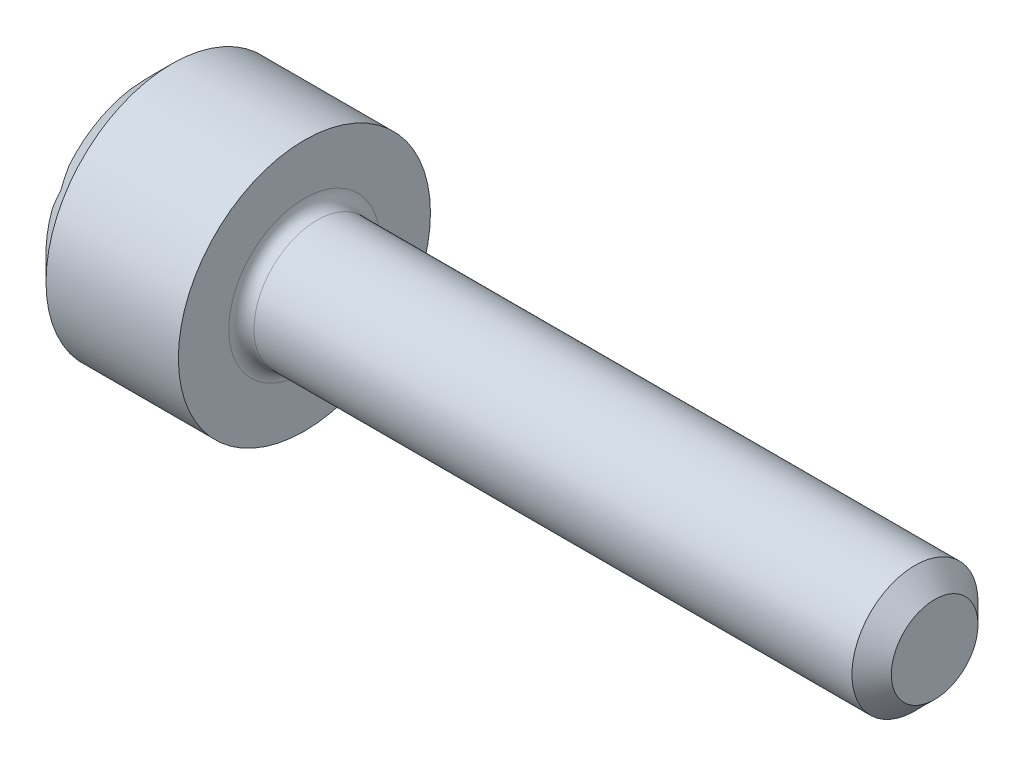
ISO-10303-21;
HEADER;
FILE_DESCRIPTION(('STEP AP214'),'2;1');
FILE_NAME('part.step','',(''),(''),'','','');
FILE_SCHEMA(('AUTOMOTIVE_DESIGN { 1 0 10303 214 1 1 1 1 }'));
ENDSEC;
DATA;
#1=APPLICATION_CONTEXT('core data for automotive mechanical design processes');
#2=APPLICATION_PROTOCOL_DEFINITION('international standard','automotive_design',2000,#1);
#3=PRODUCT_CONTEXT('',#1,'mechanical');
#4=PRODUCT('Part','Part','',(#3));
#5=PRODUCT_RELATED_PRODUCT_CATEGORY('part','',(#4));
#6=PRODUCT_DEFINITION_FORMATION('','',#4);
#7=PRODUCT_DEFINITION_CONTEXT('part definition',#1,'design');
#8=PRODUCT_DEFINITION('design','',#6,#7);
#9=PRODUCT_DEFINITION_SHAPE('','',#8);
#10=(LENGTH_UNIT() NAMED_UNIT(*) SI_UNIT(.MILLI.,.METRE.));
#11=(NAMED_UNIT(*) PLANE_ANGLE_UNIT() SI_UNIT($,.RADIAN.));
#12=(NAMED_UNIT(*) SI_UNIT($,.STERADIAN.) SOLID_ANGLE_UNIT());
#13=UNCERTAINTY_MEASURE_WITH_UNIT(LENGTH_MEASURE(1.E-05),#10,'distance_accuracy_value','');
#14=(GEOMETRIC_REPRESENTATION_CONTEXT(3) GLOBAL_UNCERTAINTY_ASSIGNED_CONTEXT((#13)) GLOBAL_UNIT_ASSIGNED_CONTEXT((#10,
#11,#12)) REPRESENTATION_CONTEXT('',''));
#15=CARTESIAN_POINT('',(0.,0.,0.));
#16=DIRECTION('',(0.,0.,1.));
#17=DIRECTION('',(1.,0.,0.));
#18=AXIS2_PLACEMENT_3D('',#15,#16,#17);
#19=CARTESIAN_POINT('',(0.,0.,0.));
#20=DIRECTION('',(-1.,0.,0.));
#21=DIRECTION('',(0.,0.,1.));
#22=AXIS2_PLACEMENT_3D('',#19,#20,#21);
#23=PLANE('',#22);
#24=DIRECTION('',(0.,0.5,-0.866025403784439));
#25=VECTOR('',#24,1.);
#26=CARTESIAN_POINT('',(0.,1.73205080756888,3.));
#27=LINE('',#26,#25);
#28=CARTESIAN_POINT('',(0.,2.04129977507032,2.46436507609928));
#29=VERTEX_POINT('',#28);
#30=CARTESIAN_POINT('',(0.,3.15485264763631,0.535634923900716));
#31=VERTEX_POINT('',#30);
#32=EDGE_CURVE('E191',#29,#31,#27,.T.);
#33=ORIENTED_EDGE('',*,*,#32,.F.);
#34=CARTESIAN_POINT('',(0.,0.,0.));
#35=DIRECTION('',(-1.,0.,0.));
#36=DIRECTION('',(0.,0.,1.));
#37=AXIS2_PLACEMENT_3D('',#34,#35,#36);
#38=CIRCLE('',#37,3.19999999999999);
#39=EDGE_CURVE('E238',#29,#31,#38,.T.);
#40=ORIENTED_EDGE('',*,*,#39,.T.);
#41=EDGE_LOOP('',(#33,#40));
#42=FACE_BOUND('',#41,.T.);
#43=ADVANCED_FACE('F33',(#42),#23,.T.);
#44=DIRECTION('',(0.,-0.5,-0.866025403784439));
#45=VECTOR('',#44,1.);
#46=CARTESIAN_POINT('',(0.,3.46410161513775,0.));
#47=LINE('',#46,#45);
#48=CARTESIAN_POINT('',(0.,3.15485264763631,-0.535634923900718));
#49=VERTEX_POINT('',#48);
#50=CARTESIAN_POINT('',(0.,2.04129977507032,-2.46436507609928));
#51=VERTEX_POINT('',#50);
#52=EDGE_CURVE('E194',#49,#51,#47,.T.);
#53=ORIENTED_EDGE('',*,*,#52,.F.);
#54=CARTESIAN_POINT('',(0.,0.,0.));
#55=DIRECTION('',(-1.,0.,0.));
#56=DIRECTION('',(0.,0.,1.));
#57=AXIS2_PLACEMENT_3D('',#54,#55,#56);
#58=CIRCLE('',#57,3.19999999999999);
#59=EDGE_CURVE('E236',#49,#51,#58,.T.);
#60=ORIENTED_EDGE('',*,*,#59,.T.);
#61=EDGE_LOOP('',(#53,#60));
#62=FACE_BOUND('',#61,.T.);
#63=ADVANCED_FACE('F303',(#62),#23,.T.);
#64=DIRECTION('',(0.,-1.,0.));
#65=VECTOR('',#64,1.);
#66=CARTESIAN_POINT('',(0.,1.73205080756888,-3.));
#67=LINE('',#66,#65);
#68=CARTESIAN_POINT('',(0.,1.11355287256599,-3.));
#69=VERTEX_POINT('',#68);
#70=CARTESIAN_POINT('',(0.,-1.11355287256599,-3.));
#71=VERTEX_POINT('',#70);
#72=EDGE_CURVE('E156',#69,#71,#67,.T.);
#73=ORIENTED_EDGE('',*,*,#72,.F.);
#74=CARTESIAN_POINT('',(0.,0.,0.));
#75=DIRECTION('',(-1.,0.,0.));
#76=DIRECTION('',(0.,0.,1.));
#77=AXIS2_PLACEMENT_3D('',#74,#75,#76);
#78=CIRCLE('',#77,3.19999999999999);
#79=EDGE_CURVE('E234',#69,#71,#78,.T.);
#80=ORIENTED_EDGE('',*,*,#79,.T.);
#81=EDGE_LOOP('',(#73,#80));
#82=FACE_BOUND('',#81,.T.);
#83=ADVANCED_FACE('F310',(#82),#23,.T.);
#84=DIRECTION('',(0.,-0.5,0.866025403784439));
#85=VECTOR('',#84,1.);
#86=CARTESIAN_POINT('',(0.,-1.73205080756888,-3.));
#87=LINE('',#86,#85);
#88=CARTESIAN_POINT('',(0.,-2.04129977507032,-2.46436507609928));
#89=VERTEX_POINT('',#88);
#90=CARTESIAN_POINT('',(0.,-3.15485264763631,-0.535634923900718));
#91=VERTEX_POINT('',#90);
#92=EDGE_CURVE('E184',#89,#91,#87,.T.);
#93=ORIENTED_EDGE('',*,*,#92,.F.);
#94=CARTESIAN_POINT('',(0.,0.,0.));
#95=DIRECTION('',(-1.,0.,0.));
#96=DIRECTION('',(0.,0.,1.));
#97=AXIS2_PLACEMENT_3D('',#94,#95,#96);
#98=CIRCLE('',#97,3.19999999999999);
#99=EDGE_CURVE('E232',#89,#91,#98,.T.);
#100=ORIENTED_EDGE('',*,*,#99,.T.);
#101=EDGE_LOOP('',(#93,#100));
#102=FACE_BOUND('',#101,.T.);
#103=ADVANCED_FACE('F324',(#102),#23,.T.);
#104=DIRECTION('',(0.,0.5,0.866025403784439));
#105=VECTOR('',#104,1.);
#106=CARTESIAN_POINT('',(0.,-3.46410161513775,0.));
#107=LINE('',#106,#105);
#108=CARTESIAN_POINT('',(0.,-3.15485264763631,0.53563492390072));
#109=VERTEX_POINT('',#108);
#110=CARTESIAN_POINT('',(0.,-2.04129977507032,2.46436507609928));
#111=VERTEX_POINT('',#110);
#112=EDGE_CURVE('E186',#109,#111,#107,.T.);
#113=ORIENTED_EDGE('',*,*,#112,.F.);
#114=CARTESIAN_POINT('',(0.,0.,0.));
#115=DIRECTION('',(-1.,0.,0.));
#116=DIRECTION('',(0.,0.,1.));
#117=AXIS2_PLACEMENT_3D('',#114,#115,#116);
#118=CIRCLE('',#117,3.19999999999999);
#119=EDGE_CURVE('E230',#109,#111,#118,.T.);
#120=ORIENTED_EDGE('',*,*,#119,.T.);
#121=EDGE_LOOP('',(#113,#120));
#122=FACE_BOUND('',#121,.T.);
#123=ADVANCED_FACE('F316',(#122),#23,.T.);
#124=DIRECTION('',(0.,1.,0.));
#125=VECTOR('',#124,1.);
#126=CARTESIAN_POINT('',(0.,-1.73205080756888,3.));
#127=LINE('',#126,#125);
#128=CARTESIAN_POINT('',(0.,-1.11355287256599,3.));
#129=VERTEX_POINT('',#128);
#130=CARTESIAN_POINT('',(0.,1.11355287256599,3.));
#131=VERTEX_POINT('',#130);
#132=EDGE_CURVE('E188',#129,#131,#127,.T.);
#133=ORIENTED_EDGE('',*,*,#132,.F.);
#134=CARTESIAN_POINT('',(0.,0.,0.));
#135=DIRECTION('',(-1.,0.,0.));
#136=DIRECTION('',(0.,0.,1.));
#137=AXIS2_PLACEMENT_3D('',#134,#135,#136);
#138=CIRCLE('',#137,3.19999999999999);
#139=EDGE_CURVE('E228',#129,#131,#138,.T.);
#140=ORIENTED_EDGE('',*,*,#139,.T.);
#141=EDGE_LOOP('',(#133,#140));
#142=FACE_BOUND('',#141,.T.);
#143=ADVANCED_FACE('F306',(#142),#23,.T.);
#144=CARTESIAN_POINT('',(25.,0.,0.));
#145=DIRECTION('',(1.,0.,0.));
#146=DIRECTION('',(0.,0.,-1.));
#147=AXIS2_PLACEMENT_3D('',#144,#145,#146);
#148=CYLINDRICAL_SURFACE('',#147,4.);
#149=CARTESIAN_POINT('',(0.800000000000002,0.,0.));
#150=DIRECTION('',(-1.,0.,0.));
#151=DIRECTION('',(0.,0.,1.));
#152=AXIS2_PLACEMENT_3D('',#149,#150,#151);
#153=CIRCLE('',#152,4.);
#154=CARTESIAN_POINT('',(0.800000000000002,0.,4.));
#155=VERTEX_POINT('',#154);
#156=EDGE_CURVE('E225',#155,#155,#153,.F.);
#157=ORIENTED_EDGE('',*,*,#156,.T.);
#158=EDGE_LOOP('',(#157));
#159=FACE_BOUND('',#158,.T.);
#160=CARTESIAN_POINT('',(5.,0.,0.));
#161=DIRECTION('',(1.,0.,0.));
#162=DIRECTION('',(0.,0.,-1.));
#163=AXIS2_PLACEMENT_3D('',#160,#161,#162);
#164=CIRCLE('',#163,4.);
#165=CARTESIAN_POINT('',(5.,0.,-4.));
#166=VERTEX_POINT('',#165);
#167=EDGE_CURVE('E215',#166,#166,#164,.T.);
#168=ORIENTED_EDGE('',*,*,#167,.F.);
#169=EDGE_LOOP('',(#168));
#170=FACE_BOUND('',#169,.T.);
#171=ADVANCED_FACE('F315',(#159,#170),#148,.T.);
#172=CARTESIAN_POINT('',(5.,0.,-4.));
#173=DIRECTION('',(1.,0.,0.));
#174=DIRECTION('',(0.,0.,-1.));
#175=AXIS2_PLACEMENT_3D('',#172,#173,#174);
#176=PLANE('',#175);
#177=CARTESIAN_POINT('',(5.,0.,0.));
#178=DIRECTION('',(1.,0.,0.));
#179=DIRECTION('',(0.,0.,-1.));
#180=AXIS2_PLACEMENT_3D('',#177,#178,#179);
#181=CIRCLE('',#180,2.4);
#182=CARTESIAN_POINT('',(5.,0.,-2.4));
#183=VERTEX_POINT('',#182);
#184=EDGE_CURVE('E11',#183,#183,#181,.F.);
#185=ORIENTED_EDGE('',*,*,#184,.T.);
#186=EDGE_LOOP('',(#185));
#187=FACE_BOUND('',#186,.T.);
#188=ORIENTED_EDGE('',*,*,#167,.T.);
#189=EDGE_LOOP('',(#188));
#190=FACE_BOUND('',#189,.T.);
#191=ADVANCED_FACE('F322',(#187,#190),#176,.T.);
#192=CARTESIAN_POINT('',(25.,0.,0.));
#193=DIRECTION('',(1.,0.,0.));
#194=DIRECTION('',(0.,0.,-1.));
#195=AXIS2_PLACEMENT_3D('',#192,#193,#194);
#196=CYLINDRICAL_SURFACE('',#195,2.);
#197=CARTESIAN_POINT('',(5.4,0.,0.));
#198=DIRECTION('',(1.,0.,0.));
#199=DIRECTION('',(0.,0.,-1.));
#200=AXIS2_PLACEMENT_3D('',#197,#198,#199);
#201=CIRCLE('',#200,2.);
#202=CARTESIAN_POINT('',(5.4,0.,-2.));
#203=VERTEX_POINT('',#202);
#204=EDGE_CURVE('E41',#203,#203,#201,.T.);
#205=ORIENTED_EDGE('',*,*,#204,.T.);
#206=EDGE_LOOP('',(#205));
#207=FACE_BOUND('',#206,.T.);
#208=CARTESIAN_POINT('',(24.375,0.,0.));
#209=DIRECTION('',(1.,0.,0.));
#210=DIRECTION('',(0.,0.,-1.));
#211=AXIS2_PLACEMENT_3D('',#208,#209,#210);
#212=CIRCLE('',#211,2.);
#213=CARTESIAN_POINT('',(24.375,0.,-2.));
#214=VERTEX_POINT('',#213);
#215=EDGE_CURVE('E222',#214,#214,#212,.F.);
#216=ORIENTED_EDGE('',*,*,#215,.T.);
#217=EDGE_LOOP('',(#216));
#218=FACE_BOUND('',#217,.T.);
#219=ADVANCED_FACE('F291',(#207,#218),#196,.T.);
#220=CARTESIAN_POINT('',(25.,0.,-2.));
#221=DIRECTION('',(1.,0.,0.));
#222=DIRECTION('',(0.,0.,-1.));
#223=AXIS2_PLACEMENT_3D('',#220,#221,#222);
#224=PLANE('',#223);
#225=CARTESIAN_POINT('',(25.,0.,0.));
#226=DIRECTION('',(1.,0.,0.));
#227=DIRECTION('',(0.,0.,-1.));
#228=AXIS2_PLACEMENT_3D('',#225,#226,#227);
#229=CIRCLE('',#228,1.375);
#230=CARTESIAN_POINT('',(25.,0.,-1.375));
#231=VERTEX_POINT('',#230);
#232=EDGE_CURVE('E219',#231,#231,#229,.T.);
#233=ORIENTED_EDGE('',*,*,#232,.T.);
#234=EDGE_LOOP('',(#233));
#235=FACE_BOUND('',#234,.T.);
#236=ADVANCED_FACE('F367',(#235),#224,.T.);
#237=CARTESIAN_POINT('',(25.,0.,0.));
#238=DIRECTION('',(-1.,0.,0.));
#239=DIRECTION('',(0.,0.,1.));
#240=AXIS2_PLACEMENT_3D('',#237,#238,#239);
#241=CONICAL_SURFACE('',#240,1.375,0.785398163397445);
#242=ORIENTED_EDGE('',*,*,#215,.F.);
#243=EDGE_LOOP('',(#242));
#244=FACE_BOUND('',#243,.T.);
#245=ORIENTED_EDGE('',*,*,#232,.F.);
#246=EDGE_LOOP('',(#245));
#247=FACE_BOUND('',#246,.T.);
#248=ADVANCED_FACE('F361',(#244,#247),#241,.T.);
#249=CARTESIAN_POINT('',(4.,-1.73205080756888,-3.));
#250=DIRECTION('',(0.,-0.866025403784439,-0.5));
#251=DIRECTION('',(0.,0.5,-0.866025403784439));
#252=AXIS2_PLACEMENT_3D('',#249,#250,#251);
#253=PLANE('',#252);
#254=DIRECTION('',(-1.,0.,0.));
#255=VECTOR('',#254,1.);
#256=CARTESIAN_POINT('',(4.,-1.73205080756888,-3.));
#257=LINE('',#256,#255);
#258=CARTESIAN_POINT('',(4.,-1.73205080756888,-3.));
#259=VERTEX_POINT('',#258);
#260=CARTESIAN_POINT('',(0.264101615137759,-1.73205080756888,-3.));
#261=VERTEX_POINT('',#260);
#262=EDGE_CURVE('E199',#259,#261,#257,.T.);
#263=ORIENTED_EDGE('',*,*,#262,.T.);
#264=CARTESIAN_POINT('',(0.264101615137759,-1.73205080756888,-3.));
#265=CARTESIAN_POINT('',(0.239013045834171,-1.75714195340964,-2.95654086058369));
#266=CARTESIAN_POINT('',(0.21457247390792,-1.78239782369679,-2.91279641005696));
#267=CARTESIAN_POINT('',(0.167188466711546,-1.83322609179336,-2.82475926725298));
#268=CARTESIAN_POINT('',(0.144243512742113,-1.85879813612875,-2.78046718721067));
#269=CARTESIAN_POINT('',(0.0999964216523164,-1.91030100221665,-2.69126160641101));
#270=CARTESIAN_POINT('',(0.0786945049648063,-1.93623187156128,-2.64634802322169));
#271=CARTESIAN_POINT('',(0.0379179650521344,-1.988480607889,-2.5558505572708));
#272=CARTESIAN_POINT('',(0.0184452524003179,-2.01479884701433,-2.51026602993998));
#273=CARTESIAN_POINT('',(0.,-2.04129977507032,-2.46436507609928));
#274=B_SPLINE_CURVE_WITH_KNOTS('',3,(#264,#265,#266,#267,#268,#269,#270,#271,#272,#273),
.UNSPECIFIED.,.F.,.F.,(4,2,2,2,4),(0.,0.168315435098067,0.336457205423019,0.504621494855378,
0.672959520299338),.UNSPECIFIED.);
#275=EDGE_CURVE('E336',#261,#89,#274,.T.);
#276=ORIENTED_EDGE('',*,*,#275,.T.);
#277=ORIENTED_EDGE('',*,*,#92,.T.);
#278=CARTESIAN_POINT('',(0.,-3.15485264763631,-0.535634923900718));
#279=CARTESIAN_POINT('',(0.018445252400318,-3.1813535756923,-0.489733970060021));
#280=CARTESIAN_POINT('',(0.0379179650521344,-3.20767181481763,-0.444149442729196));
#281=CARTESIAN_POINT('',(0.0786945049648063,-3.25992055114536,-0.353651976778307));
#282=CARTESIAN_POINT('',(0.0999964216523164,-3.28585142048998,-0.308738393588991));
#283=CARTESIAN_POINT('',(0.144243512742113,-3.33735428657788,-0.219532812789328));
#284=CARTESIAN_POINT('',(0.167188466711547,-3.36292633091328,-0.175240732747018));
#285=CARTESIAN_POINT('',(0.21457247390792,-3.41375459900984,-0.0872035899430409));
#286=CARTESIAN_POINT('',(0.239013045834171,-3.439010469297,-0.0434591394163142));
#287=CARTESIAN_POINT('',(0.264101615137759,-3.46410161513775,0.));
#288=B_SPLINE_CURVE_WITH_KNOTS('',3,(#278,#279,#280,#281,#282,#283,#284,#285,#286,#287),
.UNSPECIFIED.,.F.,.F.,(4,2,2,2,4),(0.,0.16833802544396,0.336502314876319,0.504644085201271,
0.672959520299337),.UNSPECIFIED.);
#289=CARTESIAN_POINT('',(0.264101615137759,-3.46410161513775,0.));
#290=VERTEX_POINT('',#289);
#291=EDGE_CURVE('E56',#91,#290,#288,.T.);
#292=ORIENTED_EDGE('',*,*,#291,.T.);
#293=DIRECTION('',(-1.,0.,0.));
#294=VECTOR('',#293,1.);
#295=CARTESIAN_POINT('',(4.,-3.46410161513775,0.));
#296=LINE('',#295,#294);
#297=CARTESIAN_POINT('',(4.,-3.46410161513775,0.));
#298=VERTEX_POINT('',#297);
#299=EDGE_CURVE('E158',#298,#290,#296,.T.);
#300=ORIENTED_EDGE('',*,*,#299,.F.);
#301=DIRECTION('',(0.,-0.5,0.866025403784439));
#302=VECTOR('',#301,1.);
#303=CARTESIAN_POINT('',(4.,-1.73205080756888,-3.));
#304=LINE('',#303,#302);
#305=CARTESIAN_POINT('',(4.,-2.59807621135332,-1.5));
#306=VERTEX_POINT('',#305);
#307=EDGE_CURVE('E147',#306,#298,#304,.T.);
#308=ORIENTED_EDGE('',*,*,#307,.F.);
#309=EDGE_CURVE('E155',#259,#306,#304,.T.);
#310=ORIENTED_EDGE('',*,*,#309,.F.);
#311=EDGE_LOOP('',(#263,#276,#277,#292,#300,#308,#310));
#312=FACE_BOUND('',#311,.T.);
#313=ADVANCED_FACE('F160',(#312),#253,.F.);
#314=CARTESIAN_POINT('',(4.,1.73205080756888,-3.));
#315=DIRECTION('',(0.,0.,-1.));
#316=DIRECTION('',(-1.,0.,0.));
#317=AXIS2_PLACEMENT_3D('',#314,#315,#316);
#318=PLANE('',#317);
#319=DIRECTION('',(-1.,0.,0.));
#320=VECTOR('',#319,1.);
#321=CARTESIAN_POINT('',(4.,1.73205080756888,-3.));
#322=LINE('',#321,#320);
#323=CARTESIAN_POINT('',(4.,1.73205080756888,-3.));
#324=VERTEX_POINT('',#323);
#325=CARTESIAN_POINT('',(0.264101615137759,1.73205080756888,-3.));
#326=VERTEX_POINT('',#325);
#327=EDGE_CURVE('E202',#324,#326,#322,.T.);
#328=ORIENTED_EDGE('',*,*,#327,.T.);
#329=CARTESIAN_POINT('',(0.264101615137759,1.73205080756888,-3.));
#330=CARTESIAN_POINT('',(0.239013045834171,1.68186851588736,-3.));
#331=CARTESIAN_POINT('',(0.21457247390792,1.63135677531305,-3.));
#332=CARTESIAN_POINT('',(0.167188466711546,1.52970023911992,-3.));
#333=CARTESIAN_POINT('',(0.144243512742114,1.47855615044913,-3.));
#334=CARTESIAN_POINT('',(0.0999964216523165,1.37555041827332,-3.));
#335=CARTESIAN_POINT('',(0.0786945049648063,1.32368867958408,-3.));
#336=CARTESIAN_POINT('',(0.0379179650521342,1.21919120692863,-3.));
#337=CARTESIAN_POINT('',(0.0184452524003177,1.16655472867796,-3.));
#338=CARTESIAN_POINT('',(0.,1.11355287256599,-3.));
#339=B_SPLINE_CURVE_WITH_KNOTS('',3,(#329,#330,#331,#332,#333,#334,#335,#336,#337,#338),
.UNSPECIFIED.,.F.,.F.,(4,2,2,2,4),(0.,0.168315435098067,0.336457205423019,0.504621494855379,
0.672959520299339),.UNSPECIFIED.);
#340=EDGE_CURVE('E560',#326,#69,#339,.T.);
#341=ORIENTED_EDGE('',*,*,#340,.T.);
#342=ORIENTED_EDGE('',*,*,#72,.T.);
#343=CARTESIAN_POINT('',(0.,-1.11355287256599,-3.));
#344=CARTESIAN_POINT('',(0.0184452524003176,-1.16655472867796,-3.));
#345=CARTESIAN_POINT('',(0.0379179650521341,-1.21919120692863,-3.));
#346=CARTESIAN_POINT('',(0.0786945049648061,-1.32368867958408,-3.));
#347=CARTESIAN_POINT('',(0.0999964216523164,-1.37555041827332,-3.));
#348=CARTESIAN_POINT('',(0.144243512742114,-1.47855615044913,-3.));
#349=CARTESIAN_POINT('',(0.167188466711546,-1.52970023911992,-3.));
#350=CARTESIAN_POINT('',(0.21457247390792,-1.63135677531305,-3.));
#351=CARTESIAN_POINT('',(0.239013045834171,-1.68186851588736,-3.));
#352=CARTESIAN_POINT('',(0.264101615137759,-1.73205080756888,-3.));
#353=B_SPLINE_CURVE_WITH_KNOTS('',3,(#343,#344,#345,#346,#347,#348,#349,#350,#351,#352),
.UNSPECIFIED.,.F.,.F.,(4,2,2,2,4),(0.,0.16833802544396,0.336502314876319,0.504644085201271,
0.672959520299339),.UNSPECIFIED.);
#354=EDGE_CURVE('E561',#71,#261,#353,.T.);
#355=ORIENTED_EDGE('',*,*,#354,.T.);
#356=ORIENTED_EDGE('',*,*,#262,.F.);
#357=DIRECTION('',(0.,-1.,0.));
#358=VECTOR('',#357,1.);
#359=CARTESIAN_POINT('',(4.,1.73205080756888,-3.));
#360=LINE('',#359,#358);
#361=CARTESIAN_POINT('',(4.,0.,-3.));
#362=VERTEX_POINT('',#361);
#363=EDGE_CURVE('E181',#362,#259,#360,.T.);
#364=ORIENTED_EDGE('',*,*,#363,.F.);
#365=EDGE_CURVE('E163',#324,#362,#360,.T.);
#366=ORIENTED_EDGE('',*,*,#365,.F.);
#367=EDGE_LOOP('',(#328,#341,#342,#355,#356,#364,#366));
#368=FACE_BOUND('',#367,.T.);
#369=ADVANCED_FACE('F360',(#368),#318,.F.);
#370=CARTESIAN_POINT('',(4.,3.46410161513775,0.));
#371=DIRECTION('',(0.,0.866025403784439,-0.5));
#372=DIRECTION('',(0.,0.5,0.866025403784439));
#373=AXIS2_PLACEMENT_3D('',#370,#371,#372);
#374=PLANE('',#373);
#375=DIRECTION('',(-1.,0.,0.));
#376=VECTOR('',#375,1.);
#377=CARTESIAN_POINT('',(4.,3.46410161513775,0.));
#378=LINE('',#377,#376);
#379=CARTESIAN_POINT('',(4.,3.46410161513775,0.));
#380=VERTEX_POINT('',#379);
#381=CARTESIAN_POINT('',(0.264101615137759,3.46410161513775,0.));
#382=VERTEX_POINT('',#381);
#383=EDGE_CURVE('E205',#380,#382,#378,.T.);
#384=ORIENTED_EDGE('',*,*,#383,.T.);
#385=CARTESIAN_POINT('',(0.264101615137759,3.46410161513775,0.));
#386=CARTESIAN_POINT('',(0.239013045834171,3.439010469297,-0.043459139416314));
#387=CARTESIAN_POINT('',(0.21457247390792,3.41375459900984,-0.0872035899430408));
#388=CARTESIAN_POINT('',(0.167188466711546,3.36292633091328,-0.175240732747017));
#389=CARTESIAN_POINT('',(0.144243512742113,3.33735428657788,-0.219532812789328));
#390=CARTESIAN_POINT('',(0.099996421652316,3.28585142048998,-0.308738393588991));
#391=CARTESIAN_POINT('',(0.078694504964806,3.25992055114536,-0.353651976778307));
#392=CARTESIAN_POINT('',(0.0379179650521343,3.20767181481763,-0.444149442729196));
#393=CARTESIAN_POINT('',(0.0184452524003179,3.1813535756923,-0.489733970060021));
#394=CARTESIAN_POINT('',(0.,3.15485264763631,-0.535634923900718));
#395=B_SPLINE_CURVE_WITH_KNOTS('',3,(#385,#386,#387,#388,#389,#390,#391,#392,#393,#394),
.UNSPECIFIED.,.F.,.F.,(4,2,2,2,4),(0.,0.168315435098067,0.336457205423019,0.504621494855378,
0.672959520299337),.UNSPECIFIED.);
#396=EDGE_CURVE('E564',#382,#49,#395,.T.);
#397=ORIENTED_EDGE('',*,*,#396,.T.);
#398=ORIENTED_EDGE('',*,*,#52,.T.);
#399=CARTESIAN_POINT('',(0.,2.04129977507032,-2.46436507609928));
#400=CARTESIAN_POINT('',(0.0184452524003179,2.01479884701433,-2.51026602993998));
#401=CARTESIAN_POINT('',(0.0379179650521344,1.988480607889,-2.5558505572708));
#402=CARTESIAN_POINT('',(0.0786945049648065,1.93623187156128,-2.64634802322169));
#403=CARTESIAN_POINT('',(0.0999964216523167,1.91030100221665,-2.69126160641101));
#404=CARTESIAN_POINT('',(0.144243512742114,1.85879813612875,-2.78046718721067));
#405=CARTESIAN_POINT('',(0.167188466711547,1.83322609179336,-2.82475926725298));
#406=CARTESIAN_POINT('',(0.21457247390792,1.78239782369679,-2.91279641005696));
#407=CARTESIAN_POINT('',(0.239013045834171,1.75714195340964,-2.95654086058369));
#408=CARTESIAN_POINT('',(0.264101615137759,1.73205080756888,-3.));
#409=B_SPLINE_CURVE_WITH_KNOTS('',3,(#399,#400,#401,#402,#403,#404,#405,#406,#407,#408),
.UNSPECIFIED.,.F.,.F.,(4,2,2,2,4),(0.,0.16833802544396,0.336502314876319,0.504644085201272,
0.672959520299338),.UNSPECIFIED.);
#410=EDGE_CURVE('E581',#51,#326,#409,.T.);
#411=ORIENTED_EDGE('',*,*,#410,.T.);
#412=ORIENTED_EDGE('',*,*,#327,.F.);
#413=DIRECTION('',(0.,-0.5,-0.866025403784439));
#414=VECTOR('',#413,1.);
#415=CARTESIAN_POINT('',(4.,3.46410161513775,0.));
#416=LINE('',#415,#414);
#417=CARTESIAN_POINT('',(4.,2.59807621135332,-1.5));
#418=VERTEX_POINT('',#417);
#419=EDGE_CURVE('E177',#418,#324,#416,.T.);
#420=ORIENTED_EDGE('',*,*,#419,.F.);
#421=EDGE_CURVE('E178',#380,#418,#416,.T.);
#422=ORIENTED_EDGE('',*,*,#421,.F.);
#423=EDGE_LOOP('',(#384,#397,#398,#411,#412,#420,#422));
#424=FACE_BOUND('',#423,.T.);
#425=ADVANCED_FACE('F263',(#424),#374,.F.);
#426=CARTESIAN_POINT('',(4.,1.73205080756888,3.));
#427=DIRECTION('',(0.,0.866025403784439,0.5));
#428=DIRECTION('',(0.,-0.5,0.866025403784439));
#429=AXIS2_PLACEMENT_3D('',#426,#427,#428);
#430=PLANE('',#429);
#431=ORIENTED_EDGE('',*,*,#32,.T.);
#432=CARTESIAN_POINT('',(0.,3.15485264763631,0.535634923900716));
#433=CARTESIAN_POINT('',(0.018445252400318,3.1813535756923,0.489733970060019));
#434=CARTESIAN_POINT('',(0.0379179650521344,3.20767181481763,0.444149442729195));
#435=CARTESIAN_POINT('',(0.0786945049648063,3.25992055114536,0.353651976778306));
#436=CARTESIAN_POINT('',(0.0999964216523164,3.28585142048998,0.30873839358899));
#437=CARTESIAN_POINT('',(0.144243512742113,3.33735428657788,0.219532812789327));
#438=CARTESIAN_POINT('',(0.167188466711546,3.36292633091328,0.175240732747017));
#439=CARTESIAN_POINT('',(0.21457247390792,3.41375459900984,0.0872035899430405));
#440=CARTESIAN_POINT('',(0.239013045834171,3.439010469297,0.0434591394163139));
#441=CARTESIAN_POINT('',(0.264101615137759,3.46410161513775,0.));
#442=B_SPLINE_CURVE_WITH_KNOTS('',3,(#432,#433,#434,#435,#436,#437,#438,#439,#440,#441),
.UNSPECIFIED.,.F.,.F.,(4,2,2,2,4),(0.,0.168338025443959,0.336502314876318,0.504644085201269,
0.672959520299336),.UNSPECIFIED.);
#443=EDGE_CURVE('E248',#31,#382,#442,.T.);
#444=ORIENTED_EDGE('',*,*,#443,.T.);
#445=ORIENTED_EDGE('',*,*,#383,.F.);
#446=DIRECTION('',(0.,0.5,-0.866025403784439));
#447=VECTOR('',#446,1.);
#448=CARTESIAN_POINT('',(4.,1.73205080756888,3.));
#449=LINE('',#448,#447);
#450=CARTESIAN_POINT('',(4.,2.59807621135332,1.5));
#451=VERTEX_POINT('',#450);
#452=EDGE_CURVE('E173',#451,#380,#449,.T.);
#453=ORIENTED_EDGE('',*,*,#452,.F.);
#454=CARTESIAN_POINT('',(4.,1.73205080756888,3.));
#455=VERTEX_POINT('',#454);
#456=EDGE_CURVE('E174',#455,#451,#449,.T.);
#457=ORIENTED_EDGE('',*,*,#456,.F.);
#458=DIRECTION('',(-1.,0.,0.));
#459=VECTOR('',#458,1.);
#460=CARTESIAN_POINT('',(4.,1.73205080756888,3.));
#461=LINE('',#460,#459);
#462=CARTESIAN_POINT('',(0.264101615137759,1.73205080756888,3.));
#463=VERTEX_POINT('',#462);
#464=EDGE_CURVE('E208',#455,#463,#461,.T.);
#465=ORIENTED_EDGE('',*,*,#464,.T.);
#466=CARTESIAN_POINT('',(0.264101615137759,1.73205080756888,3.));
#467=CARTESIAN_POINT('',(0.239013045834171,1.75714195340964,2.95654086058369));
#468=CARTESIAN_POINT('',(0.21457247390792,1.78239782369679,2.91279641005696));
#469=CARTESIAN_POINT('',(0.167188466711546,1.83322609179335,2.82475926725298));
#470=CARTESIAN_POINT('',(0.144243512742113,1.85879813612875,2.78046718721067));
#471=CARTESIAN_POINT('',(0.0999964216523164,1.91030100221665,2.69126160641101));
#472=CARTESIAN_POINT('',(0.0786945049648063,1.93623187156128,2.64634802322169));
#473=CARTESIAN_POINT('',(0.0379179650521345,1.988480607889,2.55585055727081));
#474=CARTESIAN_POINT('',(0.0184452524003182,2.01479884701433,2.51026602993998));
#475=CARTESIAN_POINT('',(0.,2.04129977507032,2.46436507609928));
#476=B_SPLINE_CURVE_WITH_KNOTS('',3,(#466,#467,#468,#469,#470,#471,#472,#473,#474,#475),
.UNSPECIFIED.,.F.,.F.,(4,2,2,2,4),(0.,0.168315435098067,0.336457205423018,0.504621494855377,
0.672959520299336),.UNSPECIFIED.);
#477=EDGE_CURVE('E241',#463,#29,#476,.T.);
#478=ORIENTED_EDGE('',*,*,#477,.T.);
#479=EDGE_LOOP('',(#431,#444,#445,#453,#457,#465,#478));
#480=FACE_BOUND('',#479,.T.);
#481=ADVANCED_FACE('F257',(#480),#430,.F.);
#482=CARTESIAN_POINT('',(4.,-1.73205080756888,3.));
#483=DIRECTION('',(0.,0.,1.));
#484=DIRECTION('',(0.,-1.,0.));
#485=AXIS2_PLACEMENT_3D('',#482,#483,#484);
#486=PLANE('',#485);
#487=DIRECTION('',(-1.,0.,0.));
#488=VECTOR('',#487,1.);
#489=CARTESIAN_POINT('',(4.,-1.73205080756888,3.));
#490=LINE('',#489,#488);
#491=CARTESIAN_POINT('',(4.,-1.73205080756888,3.));
#492=VERTEX_POINT('',#491);
#493=CARTESIAN_POINT('',(0.26410161513776,-1.73205080756888,3.));
#494=VERTEX_POINT('',#493);
#495=EDGE_CURVE('E162',#492,#494,#490,.T.);
#496=ORIENTED_EDGE('',*,*,#495,.T.);
#497=CARTESIAN_POINT('',(0.26410161513776,-1.73205080756888,3.));
#498=CARTESIAN_POINT('',(0.239013045834172,-1.68186851588736,3.));
#499=CARTESIAN_POINT('',(0.214572473907921,-1.63135677531305,3.));
#500=CARTESIAN_POINT('',(0.167188466711547,-1.52970023911992,3.));
#501=CARTESIAN_POINT('',(0.144243512742114,-1.47855615044913,3.));
#502=CARTESIAN_POINT('',(0.099996421652317,-1.37555041827332,3.));
#503=CARTESIAN_POINT('',(0.0786945049648067,-1.32368867958408,3.));
#504=CARTESIAN_POINT('',(0.0379179650521346,-1.21919120692863,3.));
#505=CARTESIAN_POINT('',(0.018445252400318,-1.16655472867796,3.));
#506=CARTESIAN_POINT('',(0.,-1.11355287256599,3.));
#507=B_SPLINE_CURVE_WITH_KNOTS('',3,(#497,#498,#499,#500,#501,#502,#503,#504,#505,#506),
.UNSPECIFIED.,.F.,.F.,(4,2,2,2,4),(0.,0.168315435098067,0.336457205423019,0.504621494855379,
0.67295952029934),.UNSPECIFIED.);
#508=EDGE_CURVE('E283',#494,#129,#507,.T.);
#509=ORIENTED_EDGE('',*,*,#508,.T.);
#510=ORIENTED_EDGE('',*,*,#132,.T.);
#511=CARTESIAN_POINT('',(0.,1.11355287256599,3.));
#512=CARTESIAN_POINT('',(0.0184452524003177,1.16655472867796,3.));
#513=CARTESIAN_POINT('',(0.0379179650521341,1.21919120692863,3.));
#514=CARTESIAN_POINT('',(0.0786945049648061,1.32368867958408,3.));
#515=CARTESIAN_POINT('',(0.0999964216523163,1.37555041827332,3.));
#516=CARTESIAN_POINT('',(0.144243512742113,1.47855615044913,3.));
#517=CARTESIAN_POINT('',(0.167188466711546,1.52970023911992,3.));
#518=CARTESIAN_POINT('',(0.21457247390792,1.63135677531304,3.));
#519=CARTESIAN_POINT('',(0.239013045834171,1.68186851588736,3.));
#520=CARTESIAN_POINT('',(0.264101615137759,1.73205080756888,3.));
#521=B_SPLINE_CURVE_WITH_KNOTS('',3,(#511,#512,#513,#514,#515,#516,#517,#518,#519,#520),
.UNSPECIFIED.,.F.,.F.,(4,2,2,2,4),(0.,0.16833802544396,0.336502314876319,0.504644085201271,
0.672959520299337),.UNSPECIFIED.);
#522=EDGE_CURVE('E276',#131,#463,#521,.T.);
#523=ORIENTED_EDGE('',*,*,#522,.T.);
#524=ORIENTED_EDGE('',*,*,#464,.F.);
#525=DIRECTION('',(0.,1.,0.));
#526=VECTOR('',#525,1.);
#527=CARTESIAN_POINT('',(4.,-1.73205080756888,3.));
#528=LINE('',#527,#526);
#529=CARTESIAN_POINT('',(4.,0.,3.));
#530=VERTEX_POINT('',#529);
#531=EDGE_CURVE('E168',#530,#455,#528,.T.);
#532=ORIENTED_EDGE('',*,*,#531,.F.);
#533=EDGE_CURVE('E170',#492,#530,#528,.T.);
#534=ORIENTED_EDGE('',*,*,#533,.F.);
#535=EDGE_LOOP('',(#496,#509,#510,#523,#524,#532,#534));
#536=FACE_BOUND('',#535,.T.);
#537=ADVANCED_FACE('F262',(#536),#486,.F.);
#538=CARTESIAN_POINT('',(4.,-3.46410161513775,0.));
#539=DIRECTION('',(0.,-0.866025403784439,0.5));
#540=DIRECTION('',(0.,-0.5,-0.866025403784439));
#541=AXIS2_PLACEMENT_3D('',#538,#539,#540);
#542=PLANE('',#541);
#543=ORIENTED_EDGE('',*,*,#299,.T.);
#544=CARTESIAN_POINT('',(0.264101615137759,-3.46410161513775,0.));
#545=CARTESIAN_POINT('',(0.239013045834172,-3.439010469297,0.0434591394163139));
#546=CARTESIAN_POINT('',(0.21457247390792,-3.41375459900984,0.0872035899430408));
#547=CARTESIAN_POINT('',(0.167188466711547,-3.36292633091328,0.175240732747018));
#548=CARTESIAN_POINT('',(0.144243512742114,-3.33735428657788,0.219532812789329));
#549=CARTESIAN_POINT('',(0.0999964216523162,-3.28585142048998,0.308738393588992));
#550=CARTESIAN_POINT('',(0.0786945049648059,-3.25992055114536,0.353651976778308));
#551=CARTESIAN_POINT('',(0.0379179650521338,-3.20767181481763,0.444149442729197));
#552=CARTESIAN_POINT('',(0.0184452524003173,-3.1813535756923,0.489733970060022));
#553=CARTESIAN_POINT('',(0.,-3.15485264763631,0.53563492390072));
#554=B_SPLINE_CURVE_WITH_KNOTS('',3,(#544,#545,#546,#547,#548,#549,#550,#551,#552,#553),
.UNSPECIFIED.,.F.,.F.,(4,2,2,2,4),(0.,0.168315435098067,0.33645720542302,0.50462149485538,
0.67295952029934),.UNSPECIFIED.);
#555=EDGE_CURVE('E334',#290,#109,#554,.T.);
#556=ORIENTED_EDGE('',*,*,#555,.T.);
#557=ORIENTED_EDGE('',*,*,#112,.T.);
#558=CARTESIAN_POINT('',(0.,-2.04129977507032,2.46436507609928));
#559=CARTESIAN_POINT('',(0.0184452524003178,-2.01479884701434,2.51026602993998));
#560=CARTESIAN_POINT('',(0.0379179650521343,-1.988480607889,2.5558505572708));
#561=CARTESIAN_POINT('',(0.0786945049648065,-1.93623187156128,2.64634802322169));
#562=CARTESIAN_POINT('',(0.0999964216523167,-1.91030100221666,2.69126160641101));
#563=CARTESIAN_POINT('',(0.144243512742114,-1.85879813612875,2.78046718721067));
#564=CARTESIAN_POINT('',(0.167188466711547,-1.83322609179336,2.82475926725298));
#565=CARTESIAN_POINT('',(0.214572473907921,-1.78239782369679,2.91279641005696));
#566=CARTESIAN_POINT('',(0.239013045834172,-1.75714195340964,2.95654086058369));
#567=CARTESIAN_POINT('',(0.26410161513776,-1.73205080756888,3.));
#568=B_SPLINE_CURVE_WITH_KNOTS('',3,(#558,#559,#560,#561,#562,#563,#564,#565,#566,#567),
.UNSPECIFIED.,.F.,.F.,(4,2,2,2,4),(0.,0.168338025443961,0.33650231487632,0.504644085201273,
0.672959520299341),.UNSPECIFIED.);
#569=EDGE_CURVE('E48',#111,#494,#568,.T.);
#570=ORIENTED_EDGE('',*,*,#569,.T.);
#571=ORIENTED_EDGE('',*,*,#495,.F.);
#572=DIRECTION('',(0.,0.5,0.866025403784439));
#573=VECTOR('',#572,1.);
#574=CARTESIAN_POINT('',(4.,-3.46410161513775,0.));
#575=LINE('',#574,#573);
#576=CARTESIAN_POINT('',(4.,-2.59807621135332,1.5));
#577=VERTEX_POINT('',#576);
#578=EDGE_CURVE('E167',#577,#492,#575,.T.);
#579=ORIENTED_EDGE('',*,*,#578,.F.);
#580=EDGE_CURVE('E150',#298,#577,#575,.T.);
#581=ORIENTED_EDGE('',*,*,#580,.F.);
#582=EDGE_LOOP('',(#543,#556,#557,#570,#571,#579,#581));
#583=FACE_BOUND('',#582,.T.);
#584=ADVANCED_FACE('F166',(#583),#542,.F.);
#585=CARTESIAN_POINT('',(4.,0.,0.));
#586=DIRECTION('',(-1.,0.,0.));
#587=DIRECTION('',(0.,0.,1.));
#588=AXIS2_PLACEMENT_3D('',#585,#586,#587);
#589=PLANE('',#588);
#590=ORIENTED_EDGE('',*,*,#531,.T.);
#591=ORIENTED_EDGE('',*,*,#456,.T.);
#592=CARTESIAN_POINT('',(4.,0.,0.));
#593=DIRECTION('',(-1.,0.,0.));
#594=DIRECTION('',(0.,0.,1.));
#595=AXIS2_PLACEMENT_3D('',#592,#593,#594);
#596=CIRCLE('',#595,3.);
#597=EDGE_CURVE('E212',#530,#451,#596,.T.);
#598=ORIENTED_EDGE('',*,*,#597,.F.);
#599=EDGE_LOOP('',(#590,#591,#598));
#600=FACE_BOUND('',#599,.T.);
#601=ADVANCED_FACE('F428',(#600),#589,.T.);
#602=ORIENTED_EDGE('',*,*,#452,.T.);
#603=ORIENTED_EDGE('',*,*,#421,.T.);
#604=EDGE_CURVE('E216',#451,#418,#596,.T.);
#605=ORIENTED_EDGE('',*,*,#604,.F.);
#606=EDGE_LOOP('',(#602,#603,#605));
#607=FACE_BOUND('',#606,.T.);
#608=ADVANCED_FACE('F433',(#607),#589,.T.);
#609=ORIENTED_EDGE('',*,*,#419,.T.);
#610=ORIENTED_EDGE('',*,*,#365,.T.);
#611=EDGE_CURVE('E604',#418,#362,#596,.T.);
#612=ORIENTED_EDGE('',*,*,#611,.F.);
#613=EDGE_LOOP('',(#609,#610,#612));
#614=FACE_BOUND('',#613,.T.);
#615=ADVANCED_FACE('F441',(#614),#589,.T.);
#616=ORIENTED_EDGE('',*,*,#363,.T.);
#617=ORIENTED_EDGE('',*,*,#309,.T.);
#618=EDGE_CURVE('E599',#362,#306,#596,.T.);
#619=ORIENTED_EDGE('',*,*,#618,.F.);
#620=EDGE_LOOP('',(#616,#617,#619));
#621=FACE_BOUND('',#620,.T.);
#622=ADVANCED_FACE('F448',(#621),#589,.T.);
#623=ORIENTED_EDGE('',*,*,#307,.T.);
#624=ORIENTED_EDGE('',*,*,#580,.T.);
#625=EDGE_CURVE('E152',#306,#577,#596,.T.);
#626=ORIENTED_EDGE('',*,*,#625,.F.);
#627=EDGE_LOOP('',(#623,#624,#626));
#628=FACE_BOUND('',#627,.T.);
#629=ADVANCED_FACE('F148',(#628),#589,.T.);
#630=ORIENTED_EDGE('',*,*,#578,.T.);
#631=ORIENTED_EDGE('',*,*,#533,.T.);
#632=EDGE_CURVE('E201',#577,#530,#596,.T.);
#633=ORIENTED_EDGE('',*,*,#632,.F.);
#634=EDGE_LOOP('',(#630,#631,#633));
#635=FACE_BOUND('',#634,.T.);
#636=ADVANCED_FACE('F365',(#635),#589,.T.);
#637=CARTESIAN_POINT('',(5.7320508075689,0.,0.));
#638=DIRECTION('',(-1.,0.,0.));
#639=DIRECTION('',(0.,0.,1.));
#640=AXIS2_PLACEMENT_3D('',#637,#638,#639);
#641=CONICAL_SURFACE('',#640,0.,1.04719755119659);
#642=ORIENTED_EDGE('',*,*,#597,.T.);
#643=ORIENTED_EDGE('',*,*,#604,.T.);
#644=ORIENTED_EDGE('',*,*,#611,.T.);
#645=ORIENTED_EDGE('',*,*,#618,.T.);
#646=ORIENTED_EDGE('',*,*,#625,.T.);
#647=ORIENTED_EDGE('',*,*,#632,.T.);
#648=EDGE_LOOP('',(#642,#643,#644,#645,#646,#647));
#649=FACE_BOUND('',#648,.T.);
#650=CARTESIAN_POINT('',(5.7320508075689,0.,0.));
#651=VERTEX_POINT('',#650);
#652=VERTEX_LOOP('',#651);
#653=FACE_BOUND('',#652,.T.);
#654=ADVANCED_FACE('F299',(#649,#653),#641,.F.);
#655=CARTESIAN_POINT('',(0.800000000000002,0.,0.));
#656=DIRECTION('',(1.,0.,0.));
#657=DIRECTION('',(0.,0.,-1.));
#658=AXIS2_PLACEMENT_3D('',#655,#656,#657);
#659=CONICAL_SURFACE('',#658,4.,0.78539816339745);
#660=ORIENTED_EDGE('',*,*,#443,.F.);
#661=ORIENTED_EDGE('',*,*,#39,.F.);
#662=ORIENTED_EDGE('',*,*,#477,.F.);
#663=ORIENTED_EDGE('',*,*,#522,.F.);
#664=ORIENTED_EDGE('',*,*,#139,.F.);
#665=ORIENTED_EDGE('',*,*,#508,.F.);
#666=ORIENTED_EDGE('',*,*,#569,.F.);
#667=ORIENTED_EDGE('',*,*,#119,.F.);
#668=ORIENTED_EDGE('',*,*,#555,.F.);
#669=ORIENTED_EDGE('',*,*,#291,.F.);
#670=ORIENTED_EDGE('',*,*,#99,.F.);
#671=ORIENTED_EDGE('',*,*,#275,.F.);
#672=ORIENTED_EDGE('',*,*,#354,.F.);
#673=ORIENTED_EDGE('',*,*,#79,.F.);
#674=ORIENTED_EDGE('',*,*,#340,.F.);
#675=ORIENTED_EDGE('',*,*,#410,.F.);
#676=ORIENTED_EDGE('',*,*,#59,.F.);
#677=ORIENTED_EDGE('',*,*,#396,.F.);
#678=EDGE_LOOP('',(#660,#661,#662,#663,#664,#665,#666,#667,#668,#669,#670,#671,#672,#673,#674,
#675,#676,#677));
#679=FACE_BOUND('',#678,.T.);
#680=ORIENTED_EDGE('',*,*,#156,.F.);
#681=EDGE_LOOP('',(#680));
#682=FACE_BOUND('',#681,.T.);
#683=ADVANCED_FACE('F254',(#679,#682),#659,.T.);
#684=CARTESIAN_POINT('',(5.4,0.,0.));
#685=DIRECTION('',(1.,0.,0.));
#686=DIRECTION('',(0.,0.,-1.));
#687=AXIS2_PLACEMENT_3D('',#684,#685,#686);
#688=TOROIDAL_SURFACE('',#687,2.4,0.4);
#689=ORIENTED_EDGE('',*,*,#184,.F.);
#690=EDGE_LOOP('',(#689));
#691=FACE_BOUND('',#690,.T.);
#692=ORIENTED_EDGE('',*,*,#204,.F.);
#693=EDGE_LOOP('',(#692));
#694=FACE_BOUND('',#693,.T.);
#695=ADVANCED_FACE('F35',(#691,#694),#688,.F.);
#696=CLOSED_SHELL('',(#43,#63,#83,#103,#123,#143,#171,#191,#219,#236,#248,#313,#369,#425,#481,
#537,#584,#601,#608,#615,#622,#629,#636,#654,#683,#695));
#697=MANIFOLD_SOLID_BREP('B2',#696);
#698=ADVANCED_BREP_SHAPE_REPRESENTATION('',(#18,#697),#14);
#699=SHAPE_DEFINITION_REPRESENTATION(#9,#698);
ENDSEC;
END-ISO-10303-21;
